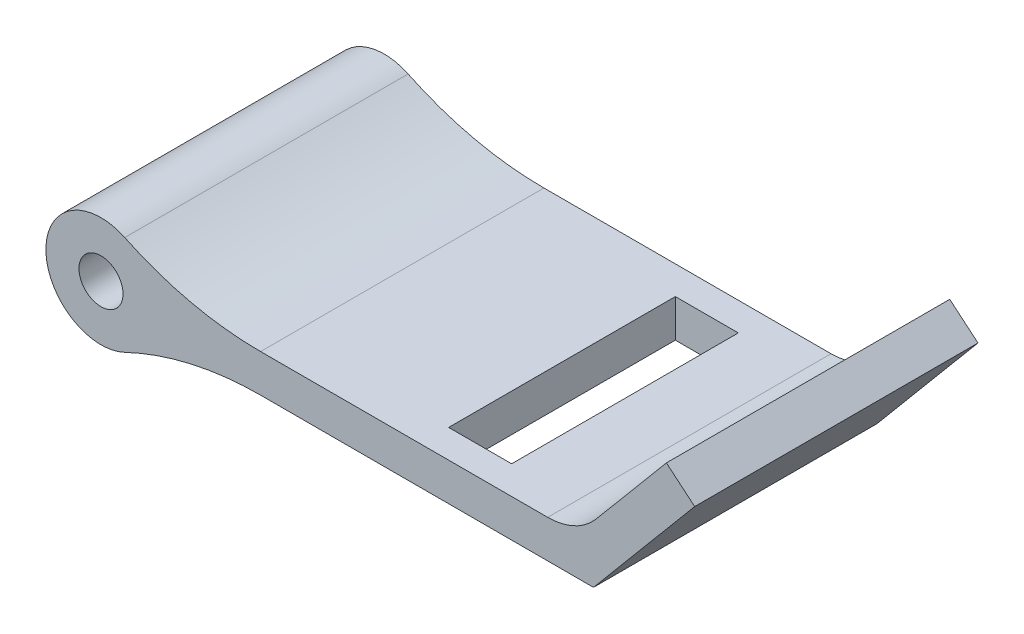
ISO-10303-21;
HEADER;
FILE_DESCRIPTION(('STEP AP214'),'2;1');
FILE_NAME('part.step','',(''),(''),'','','');
FILE_SCHEMA(('AUTOMOTIVE_DESIGN { 1 0 10303 214 1 1 1 1 }'));
ENDSEC;
DATA;
#1=APPLICATION_CONTEXT('core data for automotive mechanical design processes');
#2=APPLICATION_PROTOCOL_DEFINITION('international standard','automotive_design',2000,#1);
#3=PRODUCT_CONTEXT('',#1,'mechanical');
#4=PRODUCT('Part','Part','',(#3));
#5=PRODUCT_RELATED_PRODUCT_CATEGORY('part','',(#4));
#6=PRODUCT_DEFINITION_FORMATION('','',#4);
#7=PRODUCT_DEFINITION_CONTEXT('part definition',#1,'design');
#8=PRODUCT_DEFINITION('design','',#6,#7);
#9=PRODUCT_DEFINITION_SHAPE('','',#8);
#10=(LENGTH_UNIT() NAMED_UNIT(*) SI_UNIT(.MILLI.,.METRE.));
#11=(NAMED_UNIT(*) PLANE_ANGLE_UNIT() SI_UNIT($,.RADIAN.));
#12=(NAMED_UNIT(*) SI_UNIT($,.STERADIAN.) SOLID_ANGLE_UNIT());
#13=UNCERTAINTY_MEASURE_WITH_UNIT(LENGTH_MEASURE(1.E-05),#10,'distance_accuracy_value','');
#14=(GEOMETRIC_REPRESENTATION_CONTEXT(3) GLOBAL_UNCERTAINTY_ASSIGNED_CONTEXT((#13)) GLOBAL_UNIT_ASSIGNED_CONTEXT((#10,
#11,#12)) REPRESENTATION_CONTEXT('',''));
#15=CARTESIAN_POINT('',(0.,0.,0.));
#16=DIRECTION('',(0.,0.,1.));
#17=DIRECTION('',(1.,0.,0.));
#18=AXIS2_PLACEMENT_3D('',#15,#16,#17);
#19=CARTESIAN_POINT('',(0.,1.2,0.));
#20=DIRECTION('',(0.,-1.,0.));
#21=DIRECTION('',(0.,0.,-1.));
#22=AXIS2_PLACEMENT_3D('',#19,#20,#21);
#23=PLANE('',#22);
#24=DIRECTION('',(0.,0.,-1.));
#25=VECTOR('',#24,1.);
#26=CARTESIAN_POINT('',(3.5,1.2,3.6));
#27=LINE('',#26,#25);
#28=CARTESIAN_POINT('',(3.5,1.2,3.6));
#29=VERTEX_POINT('',#28);
#30=CARTESIAN_POINT('',(3.5,1.2,-3.6));
#31=VERTEX_POINT('',#30);
#32=EDGE_CURVE('E206',#29,#31,#27,.T.);
#33=ORIENTED_EDGE('',*,*,#32,.F.);
#34=DIRECTION('',(1.,0.,0.));
#35=VECTOR('',#34,1.);
#36=CARTESIAN_POINT('',(1.5,1.2,3.6));
#37=LINE('',#36,#35);
#38=CARTESIAN_POINT('',(1.5,1.2,3.6));
#39=VERTEX_POINT('',#38);
#40=EDGE_CURVE('E217',#39,#29,#37,.T.);
#41=ORIENTED_EDGE('',*,*,#40,.F.);
#42=DIRECTION('',(0.,0.,1.));
#43=VECTOR('',#42,1.);
#44=CARTESIAN_POINT('',(1.5,1.2,3.6));
#45=LINE('',#44,#43);
#46=CARTESIAN_POINT('',(1.5,1.2,-3.6));
#47=VERTEX_POINT('',#46);
#48=EDGE_CURVE('E213',#47,#39,#45,.T.);
#49=ORIENTED_EDGE('',*,*,#48,.F.);
#50=DIRECTION('',(-1.,0.,0.));
#51=VECTOR('',#50,1.);
#52=CARTESIAN_POINT('',(1.5,1.2,-3.6));
#53=LINE('',#52,#51);
#54=EDGE_CURVE('E209',#31,#47,#53,.T.);
#55=ORIENTED_EDGE('',*,*,#54,.F.);
#56=EDGE_LOOP('',(#33,#41,#49,#55));
#57=FACE_BOUND('',#56,.T.);
#58=DIRECTION('',(1.,0.,0.));
#59=VECTOR('',#58,1.);
#60=CARTESIAN_POINT('',(-7.,1.2,4.5));
#61=LINE('',#60,#59);
#62=CARTESIAN_POINT('',(-3.57416491419285,1.2,4.5));
#63=VERTEX_POINT('',#62);
#64=CARTESIAN_POINT('',(5.5452217679571,1.2,4.5));
#65=VERTEX_POINT('',#64);
#66=EDGE_CURVE('E250',#63,#65,#61,.T.);
#67=ORIENTED_EDGE('',*,*,#66,.T.);
#68=DIRECTION('',(0.,0.,1.));
#69=VECTOR('',#68,1.);
#70=CARTESIAN_POINT('',(5.5452217679571,1.2,-4.5));
#71=LINE('',#70,#69);
#72=CARTESIAN_POINT('',(5.5452217679571,1.2,-4.5));
#73=VERTEX_POINT('',#72);
#74=EDGE_CURVE('E63',#65,#73,#71,.F.);
#75=ORIENTED_EDGE('',*,*,#74,.T.);
#76=DIRECTION('',(-1.,0.,0.));
#77=VECTOR('',#76,1.);
#78=CARTESIAN_POINT('',(-7.,1.2,-4.5));
#79=LINE('',#78,#77);
#80=CARTESIAN_POINT('',(-3.57416491419285,1.2,-4.5));
#81=VERTEX_POINT('',#80);
#82=EDGE_CURVE('E247',#73,#81,#79,.T.);
#83=ORIENTED_EDGE('',*,*,#82,.T.);
#84=DIRECTION('',(0.,0.,1.));
#85=VECTOR('',#84,1.);
#86=CARTESIAN_POINT('',(-3.57416491419285,1.2,4.5));
#87=LINE('',#86,#85);
#88=EDGE_CURVE('E264',#81,#63,#87,.T.);
#89=ORIENTED_EDGE('',*,*,#88,.T.);
#90=EDGE_LOOP('',(#67,#75,#83,#89));
#91=FACE_BOUND('',#90,.T.);
#92=ADVANCED_FACE('F41',(#57,#91),#23,.F.);
#93=CARTESIAN_POINT('',(0.,0.,0.));
#94=DIRECTION('',(0.,-1.,0.));
#95=DIRECTION('',(0.,0.,-1.));
#96=AXIS2_PLACEMENT_3D('',#93,#94,#95);
#97=PLANE('',#96);
#98=DIRECTION('',(1.,0.,0.));
#99=VECTOR('',#98,1.);
#100=CARTESIAN_POINT('',(-7.,0.,4.5));
#101=LINE('',#100,#99);
#102=CARTESIAN_POINT('',(-3.57416491419285,0.,4.5));
#103=VERTEX_POINT('',#102);
#104=CARTESIAN_POINT('',(7.,0.,4.5));
#105=VERTEX_POINT('',#104);
#106=EDGE_CURVE('E149',#103,#105,#101,.T.);
#107=ORIENTED_EDGE('',*,*,#106,.F.);
#108=DIRECTION('',(0.,0.,-1.));
#109=VECTOR('',#108,1.);
#110=CARTESIAN_POINT('',(-3.57416491419285,0.,0.));
#111=LINE('',#110,#109);
#112=CARTESIAN_POINT('',(-3.57416491419285,0.,-4.5));
#113=VERTEX_POINT('',#112);
#114=EDGE_CURVE('E144',#103,#113,#111,.T.);
#115=ORIENTED_EDGE('',*,*,#114,.T.);
#116=DIRECTION('',(-1.,0.,0.));
#117=VECTOR('',#116,1.);
#118=CARTESIAN_POINT('',(-7.,0.,-4.5));
#119=LINE('',#118,#117);
#120=CARTESIAN_POINT('',(7.,0.,-4.5));
#121=VERTEX_POINT('',#120);
#122=EDGE_CURVE('E136',#121,#113,#119,.T.);
#123=ORIENTED_EDGE('',*,*,#122,.F.);
#124=DIRECTION('',(0.,0.,-1.));
#125=VECTOR('',#124,1.);
#126=CARTESIAN_POINT('',(7.,0.,4.5));
#127=LINE('',#126,#125);
#128=EDGE_CURVE('E141',#105,#121,#127,.T.);
#129=ORIENTED_EDGE('',*,*,#128,.F.);
#130=EDGE_LOOP('',(#107,#115,#123,#129));
#131=FACE_BOUND('',#130,.T.);
#132=DIRECTION('',(1.,0.,0.));
#133=VECTOR('',#132,1.);
#134=CARTESIAN_POINT('',(1.5,0.,3.6));
#135=LINE('',#134,#133);
#136=CARTESIAN_POINT('',(1.5,0.,3.6));
#137=VERTEX_POINT('',#136);
#138=CARTESIAN_POINT('',(3.5,0.,3.6));
#139=VERTEX_POINT('',#138);
#140=EDGE_CURVE('E210',#137,#139,#135,.T.);
#141=ORIENTED_EDGE('',*,*,#140,.T.);
#142=DIRECTION('',(0.,0.,-1.));
#143=VECTOR('',#142,1.);
#144=CARTESIAN_POINT('',(3.5,0.,3.6));
#145=LINE('',#144,#143);
#146=CARTESIAN_POINT('',(3.5,0.,-3.6));
#147=VERTEX_POINT('',#146);
#148=EDGE_CURVE('E205',#139,#147,#145,.T.);
#149=ORIENTED_EDGE('',*,*,#148,.T.);
#150=DIRECTION('',(-1.,0.,0.));
#151=VECTOR('',#150,1.);
#152=CARTESIAN_POINT('',(1.5,0.,-3.6));
#153=LINE('',#152,#151);
#154=CARTESIAN_POINT('',(1.5,0.,-3.6));
#155=VERTEX_POINT('',#154);
#156=EDGE_CURVE('E224',#147,#155,#153,.T.);
#157=ORIENTED_EDGE('',*,*,#156,.T.);
#158=DIRECTION('',(0.,0.,1.));
#159=VECTOR('',#158,1.);
#160=CARTESIAN_POINT('',(1.5,0.,3.6));
#161=LINE('',#160,#159);
#162=EDGE_CURVE('E228',#155,#137,#161,.T.);
#163=ORIENTED_EDGE('',*,*,#162,.T.);
#164=EDGE_LOOP('',(#141,#149,#157,#163));
#165=FACE_BOUND('',#164,.T.);
#166=ADVANCED_FACE('F139',(#131,#165),#97,.T.);
#167=CARTESIAN_POINT('',(-7.,1.2,-4.5));
#168=DIRECTION('',(0.,0.,1.));
#169=DIRECTION('',(1.,0.,0.));
#170=AXIS2_PLACEMENT_3D('',#167,#168,#169);
#171=PLANE('',#170);
#172=ORIENTED_EDGE('',*,*,#82,.F.);
#173=CARTESIAN_POINT('',(5.5452217679571,3.2,-4.5));
#174=DIRECTION('',(0.,0.,1.));
#175=DIRECTION('',(1.,0.,0.));
#176=AXIS2_PLACEMENT_3D('',#173,#174,#175);
#177=CIRCLE('',#176,2.);
#178=CARTESIAN_POINT('',(7.07731065419505,1.91442478062691,-4.5));
#179=VERTEX_POINT('',#178);
#180=EDGE_CURVE('E11',#73,#179,#177,.T.);
#181=ORIENTED_EDGE('',*,*,#180,.T.);
#182=DIRECTION('',(0.642787609686543,0.766044443118975,0.));
#183=VECTOR('',#182,1.);
#184=CARTESIAN_POINT('',(6.10269757094509,0.752926137274464,-4.5));
#185=LINE('',#184,#183);
#186=CARTESIAN_POINT('',(9.3166356193778,4.58314835286934,-4.5));
#187=VERTEX_POINT('',#186);
#188=EDGE_CURVE('E177',#179,#187,#185,.T.);
#189=ORIENTED_EDGE('',*,*,#188,.T.);
#190=DIRECTION('',(0.766044443118975,-0.642787609686543,0.));
#191=VECTOR('',#190,1.);
#192=CARTESIAN_POINT('',(9.3166356193778,4.58314835286934,-4.5));
#193=LINE('',#192,#191);
#194=CARTESIAN_POINT('',(10.2139380484327,3.83022221559487,-4.5));
#195=VERTEX_POINT('',#194);
#196=EDGE_CURVE('E165',#187,#195,#193,.T.);
#197=ORIENTED_EDGE('',*,*,#196,.T.);
#198=DIRECTION('',(0.642787609686543,0.766044443118975,0.));
#199=VECTOR('',#198,1.);
#200=CARTESIAN_POINT('',(7.,0.,-4.5));
#201=LINE('',#200,#199);
#202=EDGE_CURVE('E155',#121,#195,#201,.T.);
#203=ORIENTED_EDGE('',*,*,#202,.F.);
#204=ORIENTED_EDGE('',*,*,#122,.T.);
#205=CARTESIAN_POINT('',(-3.57416491419285,-10.,-4.5));
#206=DIRECTION('',(0.,0.,1.));
#207=DIRECTION('',(1.,0.,0.));
#208=AXIS2_PLACEMENT_3D('',#205,#206,#207);
#209=CIRCLE('',#208,10.);
#210=CARTESIAN_POINT('',(-7.88885709128605,-0.97872340425532,-4.5));
#211=VERTEX_POINT('',#210);
#212=EDGE_CURVE('E271',#113,#211,#209,.T.);
#213=ORIENTED_EDGE('',*,*,#212,.T.);
#214=CARTESIAN_POINT('',(-8.64392822227736,0.6,-4.5));
#215=DIRECTION('',(0.,0.,1.));
#216=DIRECTION('',(1.,0.,0.));
#217=AXIS2_PLACEMENT_3D('',#214,#215,#216);
#218=CIRCLE('',#217,1.75);
#219=CARTESIAN_POINT('',(-7.88885709128605,2.17872340425532,-4.5));
#220=VERTEX_POINT('',#219);
#221=EDGE_CURVE('E193',#220,#211,#218,.T.);
#222=ORIENTED_EDGE('',*,*,#221,.F.);
#223=CARTESIAN_POINT('',(-3.57416491419285,11.2,-4.5));
#224=DIRECTION('',(0.,0.,1.));
#225=DIRECTION('',(1.,0.,0.));
#226=AXIS2_PLACEMENT_3D('',#223,#224,#225);
#227=CIRCLE('',#226,10.);
#228=EDGE_CURVE('E277',#220,#81,#227,.T.);
#229=ORIENTED_EDGE('',*,*,#228,.T.);
#230=EDGE_LOOP('',(#172,#181,#189,#197,#203,#204,#213,#222,#229));
#231=FACE_BOUND('',#230,.T.);
#232=CARTESIAN_POINT('',(-8.64392822227736,0.6,-4.5));
#233=DIRECTION('',(0.,0.,1.));
#234=DIRECTION('',(1.,0.,0.));
#235=AXIS2_PLACEMENT_3D('',#232,#233,#234);
#236=CIRCLE('',#235,0.7);
#237=CARTESIAN_POINT('',(-7.94392822227736,0.6,-4.5));
#238=VERTEX_POINT('',#237);
#239=EDGE_CURVE('E187',#238,#238,#236,.T.);
#240=ORIENTED_EDGE('',*,*,#239,.T.);
#241=EDGE_LOOP('',(#240));
#242=FACE_BOUND('',#241,.T.);
#243=ADVANCED_FACE('F162',(#231,#242),#171,.F.);
#244=CARTESIAN_POINT('',(-7.,1.2,4.5));
#245=DIRECTION('',(0.,0.,-1.));
#246=DIRECTION('',(-1.,0.,0.));
#247=AXIS2_PLACEMENT_3D('',#244,#245,#246);
#248=PLANE('',#247);
#249=ORIENTED_EDGE('',*,*,#106,.T.);
#250=DIRECTION('',(-0.642787609686543,-0.766044443118975,0.));
#251=VECTOR('',#250,1.);
#252=CARTESIAN_POINT('',(7.,0.,4.5));
#253=LINE('',#252,#251);
#254=CARTESIAN_POINT('',(10.2139380484327,3.83022221559487,4.5));
#255=VERTEX_POINT('',#254);
#256=EDGE_CURVE('E158',#255,#105,#253,.T.);
#257=ORIENTED_EDGE('',*,*,#256,.F.);
#258=DIRECTION('',(0.766044443118975,-0.642787609686543,0.));
#259=VECTOR('',#258,1.);
#260=CARTESIAN_POINT('',(9.3166356193778,4.58314835286934,4.5));
#261=LINE('',#260,#259);
#262=CARTESIAN_POINT('',(9.3166356193778,4.58314835286934,4.5));
#263=VERTEX_POINT('',#262);
#264=EDGE_CURVE('E184',#263,#255,#261,.T.);
#265=ORIENTED_EDGE('',*,*,#264,.F.);
#266=DIRECTION('',(-0.642787609686543,-0.766044443118975,0.));
#267=VECTOR('',#266,1.);
#268=CARTESIAN_POINT('',(6.10269757094509,0.752926137274465,4.5));
#269=LINE('',#268,#267);
#270=CARTESIAN_POINT('',(7.07731065419505,1.91442478062691,4.5));
#271=VERTEX_POINT('',#270);
#272=EDGE_CURVE('E171',#263,#271,#269,.T.);
#273=ORIENTED_EDGE('',*,*,#272,.T.);
#274=CARTESIAN_POINT('',(5.5452217679571,3.2,4.5));
#275=DIRECTION('',(0.,0.,-1.));
#276=DIRECTION('',(-1.,0.,0.));
#277=AXIS2_PLACEMENT_3D('',#274,#275,#276);
#278=CIRCLE('',#277,2.);
#279=EDGE_CURVE('E50',#271,#65,#278,.T.);
#280=ORIENTED_EDGE('',*,*,#279,.T.);
#281=ORIENTED_EDGE('',*,*,#66,.F.);
#282=CARTESIAN_POINT('',(-3.57416491419285,11.2,4.5));
#283=DIRECTION('',(0.,0.,-1.));
#284=DIRECTION('',(-1.,0.,0.));
#285=AXIS2_PLACEMENT_3D('',#282,#283,#284);
#286=CIRCLE('',#285,10.);
#287=CARTESIAN_POINT('',(-7.88885709128605,2.17872340425532,4.5));
#288=VERTEX_POINT('',#287);
#289=EDGE_CURVE('E274',#63,#288,#286,.T.);
#290=ORIENTED_EDGE('',*,*,#289,.T.);
#291=CARTESIAN_POINT('',(-8.64392822227736,0.6,4.5));
#292=DIRECTION('',(0.,0.,1.));
#293=DIRECTION('',(1.,0.,0.));
#294=AXIS2_PLACEMENT_3D('',#291,#292,#293);
#295=CIRCLE('',#294,1.75);
#296=CARTESIAN_POINT('',(-7.88885709128605,-0.97872340425532,4.5));
#297=VERTEX_POINT('',#296);
#298=EDGE_CURVE('E201',#288,#297,#295,.T.);
#299=ORIENTED_EDGE('',*,*,#298,.T.);
#300=CARTESIAN_POINT('',(-3.57416491419285,-10.,4.5));
#301=DIRECTION('',(0.,0.,-1.));
#302=DIRECTION('',(-1.,0.,0.));
#303=AXIS2_PLACEMENT_3D('',#300,#301,#302);
#304=CIRCLE('',#303,10.);
#305=EDGE_CURVE('E268',#297,#103,#304,.T.);
#306=ORIENTED_EDGE('',*,*,#305,.T.);
#307=EDGE_LOOP('',(#249,#257,#265,#273,#280,#281,#290,#299,#306));
#308=FACE_BOUND('',#307,.T.);
#309=CARTESIAN_POINT('',(-8.64392822227736,0.6,4.5));
#310=DIRECTION('',(0.,0.,1.));
#311=DIRECTION('',(1.,0.,0.));
#312=AXIS2_PLACEMENT_3D('',#309,#310,#311);
#313=CIRCLE('',#312,0.7);
#314=CARTESIAN_POINT('',(-7.94392822227736,0.6,4.5));
#315=VERTEX_POINT('',#314);
#316=EDGE_CURVE('E197',#315,#315,#313,.T.);
#317=ORIENTED_EDGE('',*,*,#316,.F.);
#318=EDGE_LOOP('',(#317));
#319=FACE_BOUND('',#318,.T.);
#320=ADVANCED_FACE('F295',(#308,#319),#248,.F.);
#321=CARTESIAN_POINT('',(3.5,1.2,3.6));
#322=DIRECTION('',(-1.,0.,0.));
#323=DIRECTION('',(0.,0.,1.));
#324=AXIS2_PLACEMENT_3D('',#321,#322,#323);
#325=PLANE('',#324);
#326=ORIENTED_EDGE('',*,*,#148,.F.);
#327=DIRECTION('',(0.,-1.,0.));
#328=VECTOR('',#327,1.);
#329=CARTESIAN_POINT('',(3.5,1.2,3.6));
#330=LINE('',#329,#328);
#331=EDGE_CURVE('E220',#29,#139,#330,.T.);
#332=ORIENTED_EDGE('',*,*,#331,.F.);
#333=ORIENTED_EDGE('',*,*,#32,.T.);
#334=DIRECTION('',(0.,-1.,0.));
#335=VECTOR('',#334,1.);
#336=CARTESIAN_POINT('',(3.5,1.2,-3.6));
#337=LINE('',#336,#335);
#338=EDGE_CURVE('E160',#31,#147,#337,.T.);
#339=ORIENTED_EDGE('',*,*,#338,.T.);
#340=EDGE_LOOP('',(#326,#332,#333,#339));
#341=FACE_BOUND('',#340,.T.);
#342=ADVANCED_FACE('F318',(#341),#325,.T.);
#343=CARTESIAN_POINT('',(1.5,1.2,-3.6));
#344=DIRECTION('',(0.,0.,1.));
#345=DIRECTION('',(1.,0.,0.));
#346=AXIS2_PLACEMENT_3D('',#343,#344,#345);
#347=PLANE('',#346);
#348=ORIENTED_EDGE('',*,*,#156,.F.);
#349=ORIENTED_EDGE('',*,*,#338,.F.);
#350=ORIENTED_EDGE('',*,*,#54,.T.);
#351=DIRECTION('',(0.,-1.,0.));
#352=VECTOR('',#351,1.);
#353=CARTESIAN_POINT('',(1.5,1.2,-3.6));
#354=LINE('',#353,#352);
#355=EDGE_CURVE('E241',#47,#155,#354,.T.);
#356=ORIENTED_EDGE('',*,*,#355,.T.);
#357=EDGE_LOOP('',(#348,#349,#350,#356));
#358=FACE_BOUND('',#357,.T.);
#359=ADVANCED_FACE('F386',(#358),#347,.T.);
#360=CARTESIAN_POINT('',(1.5,1.2,3.6));
#361=DIRECTION('',(1.,0.,0.));
#362=DIRECTION('',(0.,0.,-1.));
#363=AXIS2_PLACEMENT_3D('',#360,#361,#362);
#364=PLANE('',#363);
#365=ORIENTED_EDGE('',*,*,#162,.F.);
#366=ORIENTED_EDGE('',*,*,#355,.F.);
#367=ORIENTED_EDGE('',*,*,#48,.T.);
#368=DIRECTION('',(0.,-1.,0.));
#369=VECTOR('',#368,1.);
#370=CARTESIAN_POINT('',(1.5,1.2,3.6));
#371=LINE('',#370,#369);
#372=EDGE_CURVE('E238',#39,#137,#371,.T.);
#373=ORIENTED_EDGE('',*,*,#372,.T.);
#374=EDGE_LOOP('',(#365,#366,#367,#373));
#375=FACE_BOUND('',#374,.T.);
#376=ADVANCED_FACE('F393',(#375),#364,.T.);
#377=CARTESIAN_POINT('',(1.5,1.2,3.6));
#378=DIRECTION('',(0.,0.,-1.));
#379=DIRECTION('',(-1.,0.,0.));
#380=AXIS2_PLACEMENT_3D('',#377,#378,#379);
#381=PLANE('',#380);
#382=ORIENTED_EDGE('',*,*,#140,.F.);
#383=ORIENTED_EDGE('',*,*,#372,.F.);
#384=ORIENTED_EDGE('',*,*,#40,.T.);
#385=ORIENTED_EDGE('',*,*,#331,.T.);
#386=EDGE_LOOP('',(#382,#383,#384,#385));
#387=FACE_BOUND('',#386,.T.);
#388=ADVANCED_FACE('F400',(#387),#381,.T.);
#389=CARTESIAN_POINT('',(-8.64392822227736,0.6,4.5));
#390=DIRECTION('',(0.,0.,-1.));
#391=DIRECTION('',(-1.,0.,0.));
#392=AXIS2_PLACEMENT_3D('',#389,#390,#391);
#393=CYLINDRICAL_SURFACE('',#392,1.75);
#394=ORIENTED_EDGE('',*,*,#221,.T.);
#395=DIRECTION('',(0.,0.,-1.));
#396=VECTOR('',#395,1.);
#397=CARTESIAN_POINT('',(-7.88885709128605,-0.97872340425532,4.5));
#398=LINE('',#397,#396);
#399=EDGE_CURVE('E258',#211,#297,#398,.F.);
#400=ORIENTED_EDGE('',*,*,#399,.T.);
#401=ORIENTED_EDGE('',*,*,#298,.F.);
#402=DIRECTION('',(0.,0.,-1.));
#403=VECTOR('',#402,1.);
#404=CARTESIAN_POINT('',(-7.88885709128605,2.17872340425532,4.5));
#405=LINE('',#404,#403);
#406=EDGE_CURVE('E252',#288,#220,#405,.T.);
#407=ORIENTED_EDGE('',*,*,#406,.T.);
#408=EDGE_LOOP('',(#394,#400,#401,#407));
#409=FACE_BOUND('',#408,.T.);
#410=ADVANCED_FACE('F339',(#409),#393,.T.);
#411=CARTESIAN_POINT('',(-8.64392822227736,0.6,4.5));
#412=DIRECTION('',(0.,0.,-1.));
#413=DIRECTION('',(-1.,0.,0.));
#414=AXIS2_PLACEMENT_3D('',#411,#412,#413);
#415=CYLINDRICAL_SURFACE('',#414,0.7);
#416=ORIENTED_EDGE('',*,*,#316,.T.);
#417=EDGE_LOOP('',(#416));
#418=FACE_BOUND('',#417,.T.);
#419=ORIENTED_EDGE('',*,*,#239,.F.);
#420=EDGE_LOOP('',(#419));
#421=FACE_BOUND('',#420,.T.);
#422=ADVANCED_FACE('F327',(#418,#421),#415,.F.);
#423=CARTESIAN_POINT('',(-3.57416491419285,-10.,4.5));
#424=DIRECTION('',(0.,0.,-1.));
#425=DIRECTION('',(-1.,0.,0.));
#426=AXIS2_PLACEMENT_3D('',#423,#424,#425);
#427=CYLINDRICAL_SURFACE('',#426,10.);
#428=ORIENTED_EDGE('',*,*,#212,.F.);
#429=ORIENTED_EDGE('',*,*,#114,.F.);
#430=ORIENTED_EDGE('',*,*,#305,.F.);
#431=ORIENTED_EDGE('',*,*,#399,.F.);
#432=EDGE_LOOP('',(#428,#429,#430,#431));
#433=FACE_BOUND('',#432,.T.);
#434=ADVANCED_FACE('F325',(#433),#427,.F.);
#435=CARTESIAN_POINT('',(-3.57416491419285,11.2,4.5));
#436=DIRECTION('',(0.,0.,-1.));
#437=DIRECTION('',(-1.,0.,0.));
#438=AXIS2_PLACEMENT_3D('',#435,#436,#437);
#439=CYLINDRICAL_SURFACE('',#438,10.);
#440=ORIENTED_EDGE('',*,*,#228,.F.);
#441=ORIENTED_EDGE('',*,*,#406,.F.);
#442=ORIENTED_EDGE('',*,*,#289,.F.);
#443=ORIENTED_EDGE('',*,*,#88,.F.);
#444=EDGE_LOOP('',(#440,#441,#442,#443));
#445=FACE_BOUND('',#444,.T.);
#446=ADVANCED_FACE('F306',(#445),#439,.F.);
#447=CARTESIAN_POINT('',(3.21046619277931,-2.69390099826827,0.));
#448=DIRECTION('',(0.766044443118975,-0.642787609686543,0.));
#449=DIRECTION('',(0.642787609686543,0.766044443118975,0.));
#450=AXIS2_PLACEMENT_3D('',#447,#448,#449);
#451=PLANE('',#450);
#452=ORIENTED_EDGE('',*,*,#188,.F.);
#453=DIRECTION('',(0.,0.,1.));
#454=VECTOR('',#453,1.);
#455=CARTESIAN_POINT('',(7.07731065419505,1.91442478062691,4.5));
#456=LINE('',#455,#454);
#457=EDGE_CURVE('E281',#179,#271,#456,.T.);
#458=ORIENTED_EDGE('',*,*,#457,.T.);
#459=ORIENTED_EDGE('',*,*,#272,.F.);
#460=DIRECTION('',(0.,0.,1.));
#461=VECTOR('',#460,1.);
#462=CARTESIAN_POINT('',(9.3166356193778,4.58314835286934,-4.5));
#463=LINE('',#462,#461);
#464=EDGE_CURVE('E180',#187,#263,#463,.T.);
#465=ORIENTED_EDGE('',*,*,#464,.F.);
#466=EDGE_LOOP('',(#452,#458,#459,#465));
#467=FACE_BOUND('',#466,.T.);
#468=ADVANCED_FACE('F291',(#467),#451,.F.);
#469=CARTESIAN_POINT('',(9.3166356193778,4.58314835286934,-4.5));
#470=DIRECTION('',(0.642787609686543,0.766044443118975,0.));
#471=DIRECTION('',(-0.766044443118975,0.642787609686543,0.));
#472=AXIS2_PLACEMENT_3D('',#469,#470,#471);
#473=PLANE('',#472);
#474=ORIENTED_EDGE('',*,*,#264,.T.);
#475=DIRECTION('',(0.,0.,1.));
#476=VECTOR('',#475,1.);
#477=CARTESIAN_POINT('',(10.2139380484327,3.83022221559487,-4.5));
#478=LINE('',#477,#476);
#479=EDGE_CURVE('E167',#195,#255,#478,.T.);
#480=ORIENTED_EDGE('',*,*,#479,.F.);
#481=ORIENTED_EDGE('',*,*,#196,.F.);
#482=ORIENTED_EDGE('',*,*,#464,.T.);
#483=EDGE_LOOP('',(#474,#480,#481,#482));
#484=FACE_BOUND('',#483,.T.);
#485=ADVANCED_FACE('F298',(#484),#473,.T.);
#486=CARTESIAN_POINT('',(4.10776862183422,-3.44682713554274,0.));
#487=DIRECTION('',(0.766044443118975,-0.642787609686543,0.));
#488=DIRECTION('',(0.642787609686543,0.766044443118975,0.));
#489=AXIS2_PLACEMENT_3D('',#486,#487,#488);
#490=PLANE('',#489);
#491=ORIENTED_EDGE('',*,*,#256,.T.);
#492=ORIENTED_EDGE('',*,*,#128,.T.);
#493=ORIENTED_EDGE('',*,*,#202,.T.);
#494=ORIENTED_EDGE('',*,*,#479,.T.);
#495=EDGE_LOOP('',(#491,#492,#493,#494));
#496=FACE_BOUND('',#495,.T.);
#497=ADVANCED_FACE('F153',(#496),#490,.T.);
#498=CARTESIAN_POINT('',(5.5452217679571,3.2,0.));
#499=DIRECTION('',(0.,0.,-1.));
#500=DIRECTION('',(-1.,0.,0.));
#501=AXIS2_PLACEMENT_3D('',#498,#499,#500);
#502=CYLINDRICAL_SURFACE('',#501,2.);
#503=ORIENTED_EDGE('',*,*,#180,.F.);
#504=ORIENTED_EDGE('',*,*,#74,.F.);
#505=ORIENTED_EDGE('',*,*,#279,.F.);
#506=ORIENTED_EDGE('',*,*,#457,.F.);
#507=EDGE_LOOP('',(#503,#504,#505,#506));
#508=FACE_BOUND('',#507,.T.);
#509=ADVANCED_FACE('F43',(#508),#502,.F.);
#510=CLOSED_SHELL('',(#92,#166,#243,#320,#342,#359,#376,#388,#410,#422,#434,#446,#468,#485,#497,#509));
#511=MANIFOLD_SOLID_BREP('B2',#510);
#512=ADVANCED_BREP_SHAPE_REPRESENTATION('',(#18,#511),#14);
#513=SHAPE_DEFINITION_REPRESENTATION(#9,#512);
ENDSEC;
END-ISO-10303-21;
